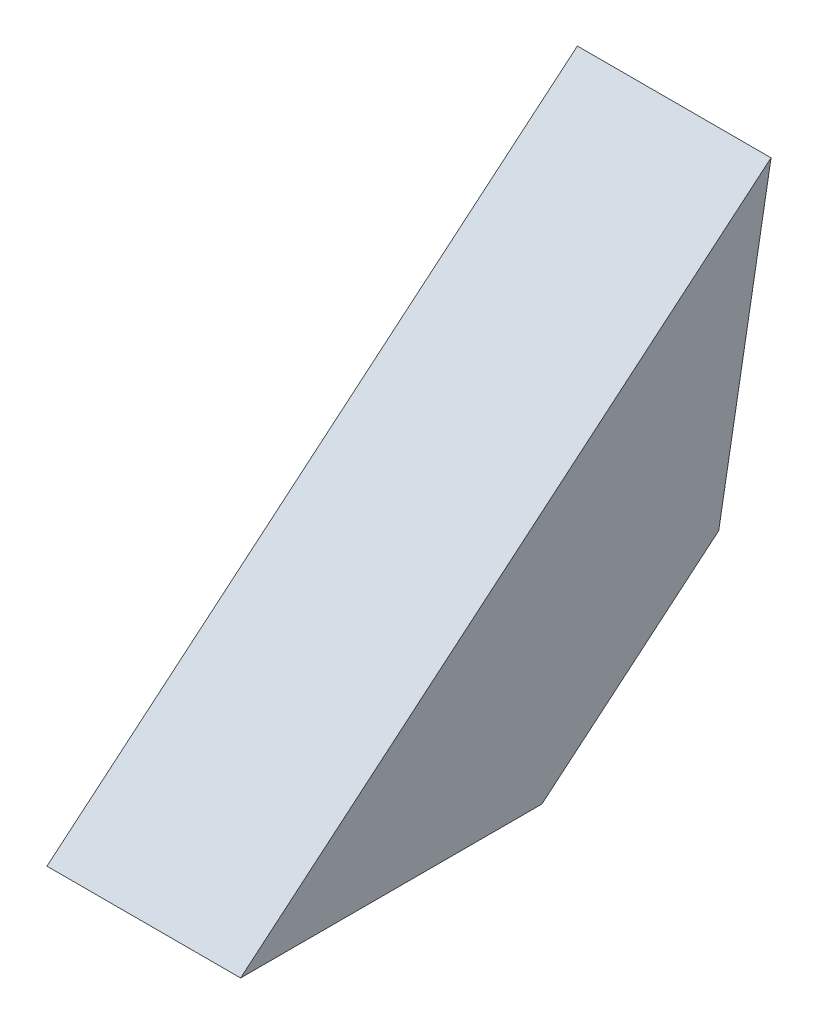
ISO-10303-21;
HEADER;
FILE_DESCRIPTION(('STEP AP214'),'2;1');
FILE_NAME('part.step','',(''),(''),'','','');
FILE_SCHEMA(('AUTOMOTIVE_DESIGN { 1 0 10303 214 1 1 1 1 }'));
ENDSEC;
DATA;
#1=APPLICATION_CONTEXT('core data for automotive mechanical design processes');
#2=APPLICATION_PROTOCOL_DEFINITION('international standard','automotive_design',2000,#1);
#3=PRODUCT_CONTEXT('',#1,'mechanical');
#4=PRODUCT('Part','Part','',(#3));
#5=PRODUCT_RELATED_PRODUCT_CATEGORY('part','',(#4));
#6=PRODUCT_DEFINITION_FORMATION('','',#4);
#7=PRODUCT_DEFINITION_CONTEXT('part definition',#1,'design');
#8=PRODUCT_DEFINITION('design','',#6,#7);
#9=PRODUCT_DEFINITION_SHAPE('','',#8);
#10=(LENGTH_UNIT() NAMED_UNIT(*) SI_UNIT(.MILLI.,.METRE.));
#11=(NAMED_UNIT(*) PLANE_ANGLE_UNIT() SI_UNIT($,.RADIAN.));
#12=(NAMED_UNIT(*) SI_UNIT($,.STERADIAN.) SOLID_ANGLE_UNIT());
#13=UNCERTAINTY_MEASURE_WITH_UNIT(LENGTH_MEASURE(1.E-05),#10,'distance_accuracy_value','');
#14=(GEOMETRIC_REPRESENTATION_CONTEXT(3) GLOBAL_UNCERTAINTY_ASSIGNED_CONTEXT((#13)) GLOBAL_UNIT_ASSIGNED_CONTEXT((#10,
#11,#12)) REPRESENTATION_CONTEXT('',''));
#15=CARTESIAN_POINT('',(0.,0.,0.));
#16=DIRECTION('',(0.,0.,1.));
#17=DIRECTION('',(1.,0.,0.));
#18=AXIS2_PLACEMENT_3D('',#15,#16,#17);
#19=CARTESIAN_POINT('',(10.,0.,0.));
#20=DIRECTION('',(0.,0.766044443118977,0.64278760968654));
#21=DIRECTION('',(0.,-0.64278760968654,0.766044443118977));
#22=AXIS2_PLACEMENT_3D('',#19,#20,#21);
#23=PLANE('',#22);
#24=DIRECTION('',(0.,0.64278760968654,-0.766044443118977));
#25=VECTOR('',#24,1.);
#26=CARTESIAN_POINT('',(0.,0.,0.));
#27=LINE('',#26,#25);
#28=CARTESIAN_POINT('',(0.,0.,0.));
#29=VERTEX_POINT('',#28);
#30=CARTESIAN_POINT('',(0.,7.66044443118976,-9.12936217173869));
#31=VERTEX_POINT('',#30);
#32=EDGE_CURVE('E107',#29,#31,#27,.T.);
#33=ORIENTED_EDGE('',*,*,#32,.T.);
#34=DIRECTION('',(-1.,0.,0.));
#35=VECTOR('',#34,1.);
#36=CARTESIAN_POINT('',(10.,7.66044443118976,-9.12936217173869));
#37=LINE('',#36,#35);
#38=CARTESIAN_POINT('',(10.,7.66044443118976,-9.12936217173869));
#39=VERTEX_POINT('',#38);
#40=EDGE_CURVE('E11',#39,#31,#37,.T.);
#41=ORIENTED_EDGE('',*,*,#40,.F.);
#42=DIRECTION('',(0.,0.64278760968654,-0.766044443118977));
#43=VECTOR('',#42,1.);
#44=CARTESIAN_POINT('',(10.,0.,0.));
#45=LINE('',#44,#43);
#46=CARTESIAN_POINT('',(10.,0.,0.));
#47=VERTEX_POINT('',#46);
#48=EDGE_CURVE('E91',#47,#39,#45,.T.);
#49=ORIENTED_EDGE('',*,*,#48,.F.);
#50=DIRECTION('',(-1.,0.,0.));
#51=VECTOR('',#50,1.);
#52=CARTESIAN_POINT('',(10.,0.,0.));
#53=LINE('',#52,#51);
#54=EDGE_CURVE('E103',#47,#29,#53,.T.);
#55=ORIENTED_EDGE('',*,*,#54,.T.);
#56=EDGE_LOOP('',(#33,#41,#49,#55));
#57=FACE_BOUND('',#56,.T.);
#58=ADVANCED_FACE('F39',(#57),#23,.F.);
#59=CARTESIAN_POINT('',(10.,7.66044443118976,-9.12936217173869));
#60=DIRECTION('',(0.,0.173648177666927,0.984807753012209));
#61=DIRECTION('',(0.,-0.984807753012209,0.173648177666927));
#62=AXIS2_PLACEMENT_3D('',#59,#60,#61);
#63=PLANE('',#62);
#64=DIRECTION('',(0.,0.984807753012209,-0.173648177666927));
#65=VECTOR('',#64,1.);
#66=CARTESIAN_POINT('',(0.,7.66044443118976,-9.12936217173869));
#67=LINE('',#66,#65);
#68=CARTESIAN_POINT('',(0.,22.9813332935693,-11.830848246612));
#69=VERTEX_POINT('',#68);
#70=EDGE_CURVE('E96',#31,#69,#67,.T.);
#71=ORIENTED_EDGE('',*,*,#70,.T.);
#72=DIRECTION('',(-1.,0.,0.));
#73=VECTOR('',#72,1.);
#74=CARTESIAN_POINT('',(10.,22.9813332935693,-11.830848246612));
#75=LINE('',#74,#73);
#76=CARTESIAN_POINT('',(10.,22.9813332935693,-11.830848246612));
#77=VERTEX_POINT('',#76);
#78=EDGE_CURVE('E48',#77,#69,#75,.T.);
#79=ORIENTED_EDGE('',*,*,#78,.F.);
#80=DIRECTION('',(0.,0.984807753012209,-0.173648177666927));
#81=VECTOR('',#80,1.);
#82=CARTESIAN_POINT('',(10.,7.66044443118976,-9.12936217173869));
#83=LINE('',#82,#81);
#84=EDGE_CURVE('E86',#39,#77,#83,.T.);
#85=ORIENTED_EDGE('',*,*,#84,.F.);
#86=ORIENTED_EDGE('',*,*,#40,.T.);
#87=EDGE_LOOP('',(#71,#79,#85,#86));
#88=FACE_BOUND('',#87,.T.);
#89=ADVANCED_FACE('F95',(#88),#63,.F.);
#90=CARTESIAN_POINT('',(10.,22.9813332935693,-11.830848246612));
#91=DIRECTION('',(0.,-0.766044443118977,-0.642787609686541));
#92=DIRECTION('',(0.,0.642787609686541,-0.766044443118977));
#93=AXIS2_PLACEMENT_3D('',#90,#91,#92);
#94=PLANE('',#93);
#95=DIRECTION('',(0.,-0.642787609686541,0.766044443118977));
#96=VECTOR('',#95,1.);
#97=CARTESIAN_POINT('',(0.,22.9813332935693,-11.830848246612));
#98=LINE('',#97,#96);
#99=CARTESIAN_POINT('',(0.,0.,15.5572382686041));
#100=VERTEX_POINT('',#99);
#101=EDGE_CURVE('E73',#69,#100,#98,.T.);
#102=ORIENTED_EDGE('',*,*,#101,.T.);
#103=DIRECTION('',(-1.,0.,0.));
#104=VECTOR('',#103,1.);
#105=CARTESIAN_POINT('',(10.,0.,15.5572382686041));
#106=LINE('',#105,#104);
#107=CARTESIAN_POINT('',(10.,0.,15.5572382686041));
#108=VERTEX_POINT('',#107);
#109=EDGE_CURVE('E98',#108,#100,#106,.T.);
#110=ORIENTED_EDGE('',*,*,#109,.F.);
#111=DIRECTION('',(0.,-0.642787609686541,0.766044443118977));
#112=VECTOR('',#111,1.);
#113=CARTESIAN_POINT('',(10.,22.9813332935693,-11.830848246612));
#114=LINE('',#113,#112);
#115=EDGE_CURVE('E89',#77,#108,#114,.T.);
#116=ORIENTED_EDGE('',*,*,#115,.F.);
#117=ORIENTED_EDGE('',*,*,#78,.T.);
#118=EDGE_LOOP('',(#102,#110,#116,#117));
#119=FACE_BOUND('',#118,.T.);
#120=ADVANCED_FACE('F99',(#119),#94,.F.);
#121=CARTESIAN_POINT('',(10.,0.,15.5572382686041));
#122=DIRECTION('',(0.,1.,0.));
#123=DIRECTION('',(0.,0.,1.));
#124=AXIS2_PLACEMENT_3D('',#121,#122,#123);
#125=PLANE('',#124);
#126=DIRECTION('',(0.,0.,-1.));
#127=VECTOR('',#126,1.);
#128=CARTESIAN_POINT('',(0.,0.,15.5572382686041));
#129=LINE('',#128,#127);
#130=EDGE_CURVE('E79',#100,#29,#129,.T.);
#131=ORIENTED_EDGE('',*,*,#130,.T.);
#132=ORIENTED_EDGE('',*,*,#54,.F.);
#133=DIRECTION('',(0.,0.,-1.));
#134=VECTOR('',#133,1.);
#135=CARTESIAN_POINT('',(10.,0.,15.5572382686041));
#136=LINE('',#135,#134);
#137=EDGE_CURVE('E56',#108,#47,#136,.T.);
#138=ORIENTED_EDGE('',*,*,#137,.F.);
#139=ORIENTED_EDGE('',*,*,#109,.T.);
#140=EDGE_LOOP('',(#131,#132,#138,#139));
#141=FACE_BOUND('',#140,.T.);
#142=ADVANCED_FACE('F120',(#141),#125,.F.);
#143=CARTESIAN_POINT('',(10.,0.,0.));
#144=DIRECTION('',(1.,0.,0.));
#145=DIRECTION('',(0.,0.,-1.));
#146=AXIS2_PLACEMENT_3D('',#143,#144,#145);
#147=PLANE('',#146);
#148=ORIENTED_EDGE('',*,*,#48,.T.);
#149=ORIENTED_EDGE('',*,*,#84,.T.);
#150=ORIENTED_EDGE('',*,*,#115,.T.);
#151=ORIENTED_EDGE('',*,*,#137,.T.);
#152=EDGE_LOOP('',(#148,#149,#150,#151));
#153=FACE_BOUND('',#152,.T.);
#154=ADVANCED_FACE('F87',(#153),#147,.T.);
#155=CARTESIAN_POINT('',(0.,0.,0.));
#156=DIRECTION('',(1.,0.,0.));
#157=DIRECTION('',(0.,0.,-1.));
#158=AXIS2_PLACEMENT_3D('',#155,#156,#157);
#159=PLANE('',#158);
#160=ORIENTED_EDGE('',*,*,#32,.F.);
#161=ORIENTED_EDGE('',*,*,#130,.F.);
#162=ORIENTED_EDGE('',*,*,#101,.F.);
#163=ORIENTED_EDGE('',*,*,#70,.F.);
#164=EDGE_LOOP('',(#160,#161,#162,#163));
#165=FACE_BOUND('',#164,.T.);
#166=ADVANCED_FACE('F123',(#165),#159,.F.);
#167=CLOSED_SHELL('',(#58,#89,#120,#142,#154,#166));
#168=MANIFOLD_SOLID_BREP('B2',#167);
#169=ADVANCED_BREP_SHAPE_REPRESENTATION('',(#18,#168),#14);
#170=SHAPE_DEFINITION_REPRESENTATION(#9,#169);
ENDSEC;
END-ISO-10303-21;
